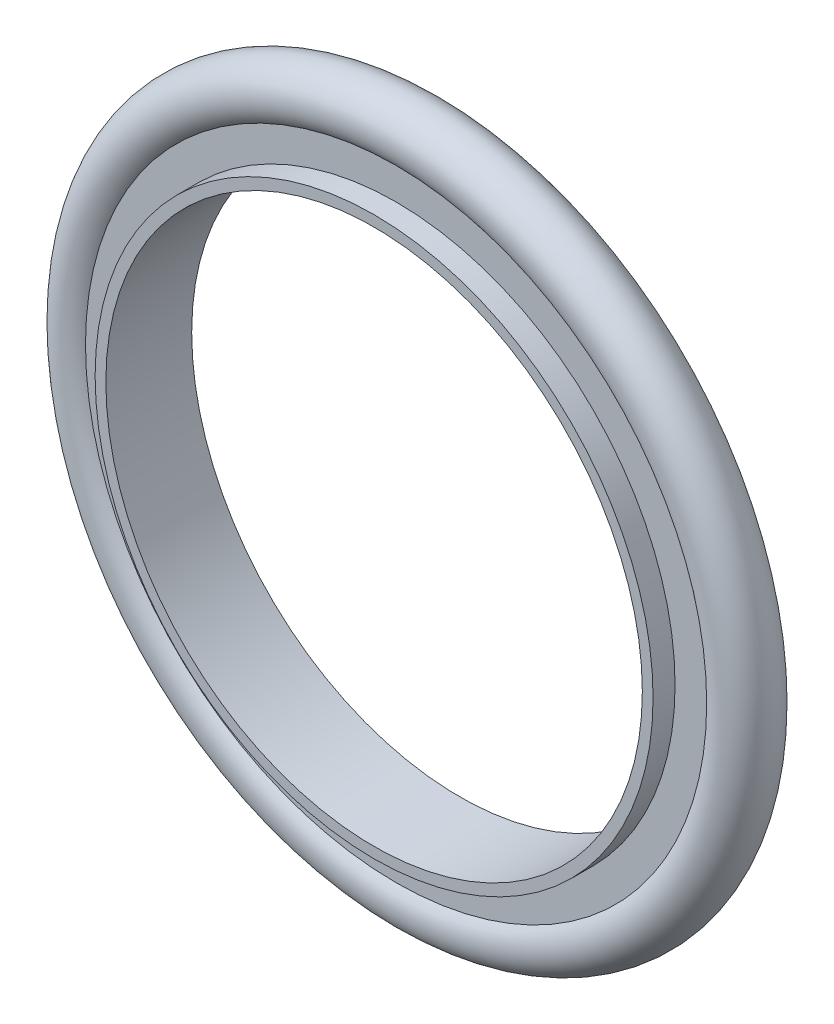
ISO-10303-21;
HEADER;
FILE_DESCRIPTION(('STEP AP214'),'2;1');
FILE_NAME('part.step','',(''),(''),'','','');
FILE_SCHEMA(('AUTOMOTIVE_DESIGN { 1 0 10303 214 1 1 1 1 }'));
ENDSEC;
DATA;
#1=APPLICATION_CONTEXT('core data for automotive mechanical design processes');
#2=APPLICATION_PROTOCOL_DEFINITION('international standard','automotive_design',2000,#1);
#3=PRODUCT_CONTEXT('',#1,'mechanical');
#4=PRODUCT('Part','Part','',(#3));
#5=PRODUCT_RELATED_PRODUCT_CATEGORY('part','',(#4));
#6=PRODUCT_DEFINITION_FORMATION('','',#4);
#7=PRODUCT_DEFINITION_CONTEXT('part definition',#1,'design');
#8=PRODUCT_DEFINITION('design','',#6,#7);
#9=PRODUCT_DEFINITION_SHAPE('','',#8);
#10=(LENGTH_UNIT() NAMED_UNIT(*) SI_UNIT(.MILLI.,.METRE.));
#11=(NAMED_UNIT(*) PLANE_ANGLE_UNIT() SI_UNIT($,.RADIAN.));
#12=(NAMED_UNIT(*) SI_UNIT($,.STERADIAN.) SOLID_ANGLE_UNIT());
#13=UNCERTAINTY_MEASURE_WITH_UNIT(LENGTH_MEASURE(1.E-05),#10,'distance_accuracy_value','');
#14=(GEOMETRIC_REPRESENTATION_CONTEXT(3) GLOBAL_UNCERTAINTY_ASSIGNED_CONTEXT((#13)) GLOBAL_UNIT_ASSIGNED_CONTEXT((#10,
#11,#12)) REPRESENTATION_CONTEXT('',''));
#15=CARTESIAN_POINT('',(0.,0.,0.));
#16=DIRECTION('',(0.,0.,1.));
#17=DIRECTION('',(1.,0.,0.));
#18=AXIS2_PLACEMENT_3D('',#15,#16,#17);
#19=CARTESIAN_POINT('',(0.,25.,4.));
#20=DIRECTION('',(0.,0.,-1.));
#21=DIRECTION('',(-1.,0.,0.));
#22=AXIS2_PLACEMENT_3D('',#19,#20,#21);
#23=PLANE('',#22);
#24=CARTESIAN_POINT('',(0.,0.,4.));
#25=DIRECTION('',(0.,0.,1.));
#26=DIRECTION('',(1.,0.,0.));
#27=AXIS2_PLACEMENT_3D('',#24,#25,#26);
#28=CIRCLE('',#27,25.);
#29=CARTESIAN_POINT('',(25.,0.,4.));
#30=VERTEX_POINT('',#29);
#31=EDGE_CURVE('E10',#30,#30,#28,.T.);
#32=ORIENTED_EDGE('',*,*,#31,.F.);
#33=EDGE_LOOP('',(#32));
#34=FACE_BOUND('',#33,.T.);
#35=CARTESIAN_POINT('',(0.,0.,4.));
#36=DIRECTION('',(0.,0.,1.));
#37=DIRECTION('',(1.,0.,0.));
#38=AXIS2_PLACEMENT_3D('',#35,#36,#37);
#39=CIRCLE('',#38,26.);
#40=CARTESIAN_POINT('',(26.,0.,4.));
#41=VERTEX_POINT('',#40);
#42=EDGE_CURVE('E58',#41,#41,#39,.T.);
#43=ORIENTED_EDGE('',*,*,#42,.T.);
#44=EDGE_LOOP('',(#43));
#45=FACE_BOUND('',#44,.T.);
#46=ADVANCED_FACE('F30',(#34,#45),#23,.F.);
#47=CARTESIAN_POINT('',(0.,0.,-6.80327383889891));
#48=DIRECTION('',(0.,0.,1.));
#49=DIRECTION('',(1.,0.,0.));
#50=AXIS2_PLACEMENT_3D('',#47,#48,#49);
#51=CYLINDRICAL_SURFACE('',#50,25.);
#52=CARTESIAN_POINT('',(0.,0.,-4.));
#53=DIRECTION('',(0.,0.,1.));
#54=DIRECTION('',(1.,0.,0.));
#55=AXIS2_PLACEMENT_3D('',#52,#53,#54);
#56=CIRCLE('',#55,25.);
#57=CARTESIAN_POINT('',(25.,0.,-4.));
#58=VERTEX_POINT('',#57);
#59=EDGE_CURVE('E36',#58,#58,#56,.T.);
#60=ORIENTED_EDGE('',*,*,#59,.F.);
#61=EDGE_LOOP('',(#60));
#62=FACE_BOUND('',#61,.T.);
#63=ORIENTED_EDGE('',*,*,#31,.T.);
#64=EDGE_LOOP('',(#63));
#65=FACE_BOUND('',#64,.T.);
#66=ADVANCED_FACE('F95',(#62,#65),#51,.F.);
#67=CARTESIAN_POINT('',(0.,25.,-4.));
#68=DIRECTION('',(0.,0.,1.));
#69=DIRECTION('',(1.,0.,0.));
#70=AXIS2_PLACEMENT_3D('',#67,#68,#69);
#71=PLANE('',#70);
#72=CARTESIAN_POINT('',(0.,0.,-4.));
#73=DIRECTION('',(0.,0.,1.));
#74=DIRECTION('',(1.,0.,0.));
#75=AXIS2_PLACEMENT_3D('',#72,#73,#74);
#76=CIRCLE('',#75,26.);
#77=CARTESIAN_POINT('',(26.,0.,-4.));
#78=VERTEX_POINT('',#77);
#79=EDGE_CURVE('E40',#78,#78,#76,.T.);
#80=ORIENTED_EDGE('',*,*,#79,.F.);
#81=EDGE_LOOP('',(#80));
#82=FACE_BOUND('',#81,.T.);
#83=ORIENTED_EDGE('',*,*,#59,.T.);
#84=EDGE_LOOP('',(#83));
#85=FACE_BOUND('',#84,.T.);
#86=ADVANCED_FACE('F90',(#82,#85),#71,.F.);
#87=CARTESIAN_POINT('',(0.,0.,-6.80327383889891));
#88=DIRECTION('',(0.,0.,1.));
#89=DIRECTION('',(1.,0.,0.));
#90=AXIS2_PLACEMENT_3D('',#87,#88,#89);
#91=CYLINDRICAL_SURFACE('',#90,26.);
#92=CARTESIAN_POINT('',(0.,0.,-1.95));
#93=DIRECTION('',(0.,0.,1.));
#94=DIRECTION('',(1.,0.,0.));
#95=AXIS2_PLACEMENT_3D('',#92,#93,#94);
#96=CIRCLE('',#95,26.);
#97=CARTESIAN_POINT('',(26.,0.,-1.95));
#98=VERTEX_POINT('',#97);
#99=EDGE_CURVE('E44',#98,#98,#96,.T.);
#100=ORIENTED_EDGE('',*,*,#99,.F.);
#101=EDGE_LOOP('',(#100));
#102=FACE_BOUND('',#101,.T.);
#103=ORIENTED_EDGE('',*,*,#79,.T.);
#104=EDGE_LOOP('',(#103));
#105=FACE_BOUND('',#104,.T.);
#106=ADVANCED_FACE('F84',(#102,#105),#91,.T.);
#107=CARTESIAN_POINT('',(0.,26.,-1.95));
#108=DIRECTION('',(0.,0.,1.));
#109=DIRECTION('',(1.,0.,0.));
#110=AXIS2_PLACEMENT_3D('',#107,#108,#109);
#111=PLANE('',#110);
#112=CARTESIAN_POINT('',(0.,0.,-1.95));
#113=DIRECTION('',(0.,0.,1.));
#114=DIRECTION('',(1.,0.,0.));
#115=AXIS2_PLACEMENT_3D('',#112,#113,#114);
#116=CIRCLE('',#115,28.947456680134);
#117=CARTESIAN_POINT('',(28.947456680134,0.,-1.95));
#118=VERTEX_POINT('',#117);
#119=EDGE_CURVE('E49',#118,#118,#116,.T.);
#120=ORIENTED_EDGE('',*,*,#119,.F.);
#121=EDGE_LOOP('',(#120));
#122=FACE_BOUND('',#121,.T.);
#123=ORIENTED_EDGE('',*,*,#99,.T.);
#124=EDGE_LOOP('',(#123));
#125=FACE_BOUND('',#124,.T.);
#126=ADVANCED_FACE('F78',(#122,#125),#111,.F.);
#127=CARTESIAN_POINT('',(0.,0.,0.));
#128=DIRECTION('',(0.,0.,1.));
#129=DIRECTION('',(1.,0.,0.));
#130=AXIS2_PLACEMENT_3D('',#127,#128,#129);
#131=TOROIDAL_SURFACE('',#130,30.7418925246266,2.65);
#132=CARTESIAN_POINT('',(0.,0.,1.95));
#133=DIRECTION('',(0.,0.,1.));
#134=DIRECTION('',(1.,0.,0.));
#135=AXIS2_PLACEMENT_3D('',#132,#133,#134);
#136=CIRCLE('',#135,28.947456680134);
#137=CARTESIAN_POINT('',(28.947456680134,0.,1.95));
#138=VERTEX_POINT('',#137);
#139=EDGE_CURVE('E52',#138,#138,#136,.T.);
#140=ORIENTED_EDGE('',*,*,#139,.F.);
#141=EDGE_LOOP('',(#140));
#142=FACE_BOUND('',#141,.T.);
#143=ORIENTED_EDGE('',*,*,#119,.T.);
#144=EDGE_LOOP('',(#143));
#145=FACE_BOUND('',#144,.T.);
#146=ADVANCED_FACE('F72',(#142,#145),#131,.T.);
#147=CARTESIAN_POINT('',(0.,26.,1.95));
#148=DIRECTION('',(0.,0.,-1.));
#149=DIRECTION('',(-1.,0.,0.));
#150=AXIS2_PLACEMENT_3D('',#147,#148,#149);
#151=PLANE('',#150);
#152=CARTESIAN_POINT('',(0.,0.,1.95));
#153=DIRECTION('',(0.,0.,1.));
#154=DIRECTION('',(1.,0.,0.));
#155=AXIS2_PLACEMENT_3D('',#152,#153,#154);
#156=CIRCLE('',#155,26.);
#157=CARTESIAN_POINT('',(26.,0.,1.95));
#158=VERTEX_POINT('',#157);
#159=EDGE_CURVE('E55',#158,#158,#156,.T.);
#160=ORIENTED_EDGE('',*,*,#159,.F.);
#161=EDGE_LOOP('',(#160));
#162=FACE_BOUND('',#161,.T.);
#163=ORIENTED_EDGE('',*,*,#139,.T.);
#164=EDGE_LOOP('',(#163));
#165=FACE_BOUND('',#164,.T.);
#166=ADVANCED_FACE('F66',(#162,#165),#151,.F.);
#167=CARTESIAN_POINT('',(0.,0.,-6.80327383889891));
#168=DIRECTION('',(0.,0.,1.));
#169=DIRECTION('',(1.,0.,0.));
#170=AXIS2_PLACEMENT_3D('',#167,#168,#169);
#171=CYLINDRICAL_SURFACE('',#170,26.);
#172=ORIENTED_EDGE('',*,*,#42,.F.);
#173=EDGE_LOOP('',(#172));
#174=FACE_BOUND('',#173,.T.);
#175=ORIENTED_EDGE('',*,*,#159,.T.);
#176=EDGE_LOOP('',(#175));
#177=FACE_BOUND('',#176,.T.);
#178=ADVANCED_FACE('F63',(#174,#177),#171,.T.);
#179=CLOSED_SHELL('',(#46,#66,#86,#106,#126,#146,#166,#178));
#180=MANIFOLD_SOLID_BREP('B2',#179);
#181=ADVANCED_BREP_SHAPE_REPRESENTATION('',(#18,#180),#14);
#182=SHAPE_DEFINITION_REPRESENTATION(#9,#181);
ENDSEC;
END-ISO-10303-21;
